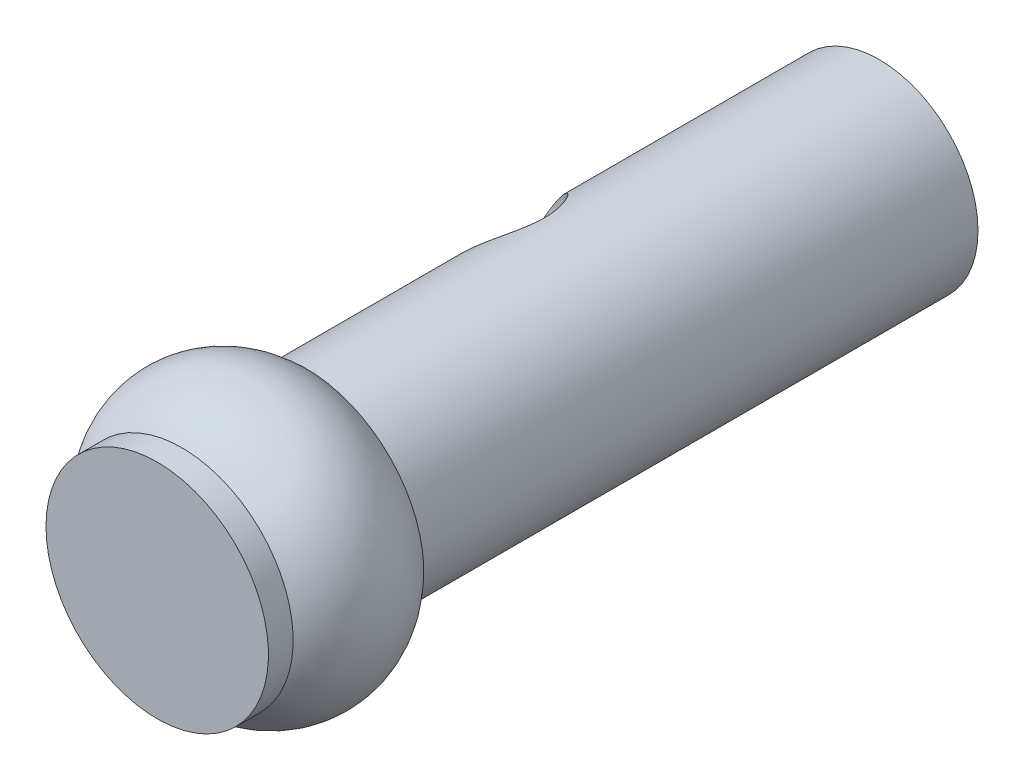
ISO-10303-21;
HEADER;
FILE_DESCRIPTION(('STEP AP214'),'2;1');
FILE_NAME('part.step','',(''),(''),'','','');
FILE_SCHEMA(('AUTOMOTIVE_DESIGN { 1 0 10303 214 1 1 1 1 }'));
ENDSEC;
DATA;
#1=APPLICATION_CONTEXT('core data for automotive mechanical design processes');
#2=APPLICATION_PROTOCOL_DEFINITION('international standard','automotive_design',2000,#1);
#3=PRODUCT_CONTEXT('',#1,'mechanical');
#4=PRODUCT('Part','Part','',(#3));
#5=PRODUCT_RELATED_PRODUCT_CATEGORY('part','',(#4));
#6=PRODUCT_DEFINITION_FORMATION('','',#4);
#7=PRODUCT_DEFINITION_CONTEXT('part definition',#1,'design');
#8=PRODUCT_DEFINITION('design','',#6,#7);
#9=PRODUCT_DEFINITION_SHAPE('','',#8);
#10=(LENGTH_UNIT() NAMED_UNIT(*) SI_UNIT(.MILLI.,.METRE.));
#11=(NAMED_UNIT(*) PLANE_ANGLE_UNIT() SI_UNIT($,.RADIAN.));
#12=(NAMED_UNIT(*) SI_UNIT($,.STERADIAN.) SOLID_ANGLE_UNIT());
#13=UNCERTAINTY_MEASURE_WITH_UNIT(LENGTH_MEASURE(1.E-05),#10,'distance_accuracy_value','');
#14=(GEOMETRIC_REPRESENTATION_CONTEXT(3) GLOBAL_UNCERTAINTY_ASSIGNED_CONTEXT((#13)) GLOBAL_UNIT_ASSIGNED_CONTEXT((#10,
#11,#12)) REPRESENTATION_CONTEXT('',''));
#15=CARTESIAN_POINT('',(0.,0.,0.));
#16=DIRECTION('',(0.,0.,1.));
#17=DIRECTION('',(1.,0.,0.));
#18=AXIS2_PLACEMENT_3D('',#15,#16,#17);
#19=CARTESIAN_POINT('',(8.,0.,-43.3427251355464));
#20=DIRECTION('',(0.,0.,1.));
#21=DIRECTION('',(1.,0.,0.));
#22=AXIS2_PLACEMENT_3D('',#19,#20,#21);
#23=PLANE('',#22);
#24=CARTESIAN_POINT('',(0.,0.,-43.3427251355464));
#25=DIRECTION('',(0.,0.,-1.));
#26=DIRECTION('',(-1.,0.,0.));
#27=AXIS2_PLACEMENT_3D('',#24,#25,#26);
#28=CIRCLE('',#27,7.);
#29=CARTESIAN_POINT('',(-7.,0.,-43.3427251355464));
#30=VERTEX_POINT('',#29);
#31=EDGE_CURVE('E56',#30,#30,#28,.T.);
#32=ORIENTED_EDGE('',*,*,#31,.F.);
#33=EDGE_LOOP('',(#32));
#34=FACE_BOUND('',#33,.T.);
#35=CARTESIAN_POINT('',(0.,0.,-43.3427251355464));
#36=DIRECTION('',(0.,0.,-1.));
#37=DIRECTION('',(-1.,0.,0.));
#38=AXIS2_PLACEMENT_3D('',#35,#36,#37);
#39=CIRCLE('',#38,8.);
#40=CARTESIAN_POINT('',(-8.,0.,-43.3427251355464));
#41=VERTEX_POINT('',#40);
#42=EDGE_CURVE('E10',#41,#41,#39,.T.);
#43=ORIENTED_EDGE('',*,*,#42,.T.);
#44=EDGE_LOOP('',(#43));
#45=FACE_BOUND('',#44,.T.);
#46=ADVANCED_FACE('F31',(#34,#45),#23,.F.);
#47=CARTESIAN_POINT('',(0.,0.,-12.7802251355462));
#48=DIRECTION('',(0.,0.,-1.));
#49=DIRECTION('',(-1.,0.,0.));
#50=AXIS2_PLACEMENT_3D('',#47,#48,#49);
#51=CYLINDRICAL_SURFACE('',#50,8.);
#52=CARTESIAN_POINT('',(-8.,0.,-18.3979131777564));
#53=CARTESIAN_POINT('',(-8.00000379197283,-0.0538071110118449,-18.6072115353037));
#54=CARTESIAN_POINT('',(-7.99950753431443,-0.0903312553594441,-18.8210144518937));
#55=CARTESIAN_POINT('',(-7.99903233148902,-0.125821796217382,-19.2517190856555));
#56=CARTESIAN_POINT('',(-7.99905323185375,-0.124799407335932,-19.468619858194));
#57=CARTESIAN_POINT('',(-7.99956684773895,-0.0853330152269476,-19.8986700638101));
#58=CARTESIAN_POINT('',(-8.00005902567663,-0.0469316490910135,-20.1118234893654));
#59=CARTESIAN_POINT('',(-7.99993171813882,0.0641395257388856,-20.5290010368897));
#60=CARTESIAN_POINT('',(-7.99931147665246,0.136832614669419,-20.7330188536219));
#61=CARTESIAN_POINT('',(-7.99432643087463,0.314332691594759,-21.1334744097809));
#62=CARTESIAN_POINT('',(-7.98985376226356,0.420008295089525,-21.3295218276569));
#63=CARTESIAN_POINT('',(-7.97382806730377,0.657424984493898,-21.7047854698601));
#64=CARTESIAN_POINT('',(-7.96227191116295,0.789177574914144,-21.8839942137409));
#65=CARTESIAN_POINT('',(-7.92606872681726,1.09793861649312,-22.2520235190141));
#66=CARTESIAN_POINT('',(-7.89955007526104,1.2788313048885,-22.4374090172871));
#67=CARTESIAN_POINT('',(-7.82763221286012,1.66323211588262,-22.779273410341));
#68=CARTESIAN_POINT('',(-7.78222060690003,1.86675502115549,-22.9357332303148));
#69=CARTESIAN_POINT('',(-7.69529435012389,2.18996617549552,-23.1496695319268));
#70=CARTESIAN_POINT('',(-7.66197740558374,2.30410445607535,-23.2191088716713));
#71=CARTESIAN_POINT('',(-7.58846793621744,2.53572166717991,-23.3480307412735));
#72=CARTESIAN_POINT('',(-7.5482784940826,2.65319908030714,-23.4075177117477));
#73=CARTESIAN_POINT('',(-7.46071241820469,2.89028284210116,-23.5158251831351));
#74=CARTESIAN_POINT('',(-7.41334013650209,3.00988786318972,-23.5646520994985));
#75=CARTESIAN_POINT('',(-7.3112435730698,3.2500350264143,-23.6510146054065));
#76=CARTESIAN_POINT('',(-7.25652043831672,3.37057701959266,-23.6885519535441));
#77=CARTESIAN_POINT('',(-7.14583575107216,3.59880786577426,-23.7484828627541));
#78=CARTESIAN_POINT('',(-7.09058663517385,3.70653761634433,-23.7720405518732));
#79=CARTESIAN_POINT('',(-6.97446955645627,3.92066333340195,-23.8092814377884));
#80=CARTESIAN_POINT('',(-6.91360223998162,4.02705945172129,-23.8229657688698));
#81=CARTESIAN_POINT('',(-6.78666910198313,4.2374771453676,-23.8402545740766));
#82=CARTESIAN_POINT('',(-6.72060575649686,4.34149982157525,-23.8438638196677));
#83=CARTESIAN_POINT('',(-6.58380893639153,4.54627547259711,-23.840961569166));
#84=CARTESIAN_POINT('',(-6.51307573225392,4.64702863628045,-23.8344506587481));
#85=CARTESIAN_POINT('',(-6.37464420957288,4.83489178714636,-23.8125196535284));
#86=CARTESIAN_POINT('',(-6.30731172822809,4.9223800921685,-23.7980199438428));
#87=CARTESIAN_POINT('',(-6.16996451203491,5.09348620289836,-23.7610222536169));
#88=CARTESIAN_POINT('',(-6.09994895241054,5.17710280071815,-23.7385217957683));
#89=CARTESIAN_POINT('',(-5.88683762990663,5.42140843313534,-23.6593763291729));
#90=CARTESIAN_POINT('',(-5.74055630336078,5.57571618096006,-23.5910676561981));
#91=CARTESIAN_POINT('',(-5.44045835219944,5.86914987080173,-23.4235701548818));
#92=CARTESIAN_POINT('',(-5.28654800882795,6.00766869896668,-23.3235024569189));
#93=CARTESIAN_POINT('',(-4.98092364033061,6.26339588211461,-23.096422248785));
#94=CARTESIAN_POINT('',(-4.82921049437364,6.38059591238782,-22.9693992546944));
#95=CARTESIAN_POINT('',(-4.51585600066594,6.60671318567899,-22.6749221102334));
#96=CARTESIAN_POINT('',(-4.35515675309513,6.71301953587711,-22.5044652776334));
#97=CARTESIAN_POINT('',(-4.05047915581013,6.90113798487598,-22.1366205813931));
#98=CARTESIAN_POINT('',(-3.90651949134214,6.98292286971633,-21.9392031477566));
#99=CARTESIAN_POINT('',(-3.70457453129652,7.09102162107309,-21.6175124562759));
#100=CARTESIAN_POINT('',(-3.63756224191589,7.12552118898537,-21.5015047355989));
#101=CARTESIAN_POINT('',(-3.51229029536752,7.18809501044659,-21.2632249275464));
#102=CARTESIAN_POINT('',(-3.45402625268954,7.2161724871197,-21.1409560204184));
#103=CARTESIAN_POINT('',(-3.34775881907738,7.26608285608204,-20.8909691958277));
#104=CARTESIAN_POINT('',(-3.29974382503592,7.28792281953068,-20.7632576387796));
#105=CARTESIAN_POINT('',(-3.21533704360038,7.32555456531639,-20.5031822065273));
#106=CARTESIAN_POINT('',(-3.17894276169418,7.34134764582772,-20.3708193365589));
#107=CARTESIAN_POINT('',(-3.12231800533015,7.36559376396495,-20.1173000435131));
#108=CARTESIAN_POINT('',(-3.1007559641428,7.37466022896961,-19.9964992643781));
#109=CARTESIAN_POINT('',(-3.06852935541023,7.38812808059409,-19.7532011012426));
#110=CARTESIAN_POINT('',(-3.05786301258706,7.39253022719357,-19.6307039969285));
#111=CARTESIAN_POINT('',(-3.04778440060533,7.39669117439936,-19.3852418384677));
#112=CARTESIAN_POINT('',(-3.04836537521865,7.39645276257402,-19.2622771096069));
#113=CARTESIAN_POINT('',(-3.06074500126026,7.39133849994213,-19.0170193331437));
#114=CARTESIAN_POINT('',(-3.07254283122624,7.38646298873186,-18.8947262370141));
#115=CARTESIAN_POINT('',(-3.10457704031209,7.37304915323547,-18.6687689547396));
#116=CARTESIAN_POINT('',(-3.1234201428225,7.36511089324098,-18.5648682167689));
#117=CARTESIAN_POINT('',(-3.16869634110085,7.34574462753782,-18.3590524731567));
#118=CARTESIAN_POINT('',(-3.1951318553091,7.33431550979895,-18.2571381113067));
#119=CARTESIAN_POINT('',(-3.28502045386628,7.29472200934024,-17.9552707363488));
#120=CARTESIAN_POINT('',(-3.35907354155438,7.26124454924504,-17.7590735750209));
#121=CARTESIAN_POINT('',(-3.53657594240227,7.17655511539993,-17.3662864942393));
#122=CARTESIAN_POINT('',(-3.64180898230458,7.1242044502762,-17.1707636934496));
#123=CARTESIAN_POINT('',(-3.87245389016822,7.00151158424241,-16.7980811855161));
#124=CARTESIAN_POINT('',(-3.99787794844169,6.93115849916124,-16.6209326787553));
#125=CARTESIAN_POINT('',(-4.28484535545407,6.75814888255125,-16.259810648122));
#126=CARTESIAN_POINT('',(-4.44893885505517,6.65208678895762,-16.0794824822805));
#127=CARTESIAN_POINT('',(-4.78838383861964,6.41205762819475,-15.7502356509382));
#128=CARTESIAN_POINT('',(-4.96374018869869,6.278078442574,-15.601330682531));
#129=CARTESIAN_POINT('',(-5.23128733017687,6.05374149648537,-15.4032594315316));
#130=CARTESIAN_POINT('',(-5.32254055589805,5.97376709183102,-15.3407587444703));
#131=CARTESIAN_POINT('',(-5.50463816680013,5.80639423729083,-15.2259768722189));
#132=CARTESIAN_POINT('',(-5.59548272710766,5.71899936722289,-15.1736907989801));
#133=CARTESIAN_POINT('',(-5.77553336841514,5.53710977468572,-15.0800254924121));
#134=CARTESIAN_POINT('',(-5.86474057402304,5.44262017107334,-15.0386384907449));
#135=CARTESIAN_POINT('',(-6.04039852189291,5.24698520570412,-14.9673330687028));
#136=CARTESIAN_POINT('',(-6.12684970473827,5.1458409157802,-14.9374128067172));
#137=CARTESIAN_POINT('',(-6.286057253359,4.94970164762314,-14.8923040989823));
#138=CARTESIAN_POINT('',(-6.35924020091749,4.85535088431945,-14.8758109303419));
#139=CARTESIAN_POINT('',(-6.50182170220991,4.66268918310291,-14.8523993992581));
#140=CARTESIAN_POINT('',(-6.5712206248221,4.5643786328325,-14.8454801019158));
#141=CARTESIAN_POINT('',(-6.70556860323235,4.36461166814436,-14.8413165470444));
#142=CARTESIAN_POINT('',(-6.77051910314775,4.26315629033578,-14.8440691343517));
#143=CARTESIAN_POINT('',(-6.89546950445539,4.05794672409862,-14.8592011496008));
#144=CARTESIAN_POINT('',(-6.9554695651635,3.9541926097848,-14.8715802676062));
#145=CARTESIAN_POINT('',(-7.06557350221683,3.75362429274648,-14.9044281849967));
#146=CARTESIAN_POINT('',(-7.11608493209942,3.6569147232328,-14.9241749800631));
#147=CARTESIAN_POINT('',(-7.21242099906376,3.46305141402775,-14.9714436282499));
#148=CARTESIAN_POINT('',(-7.25824416355781,3.36589754473094,-14.9989679141362));
#149=CARTESIAN_POINT('',(-7.38849703610198,3.07491774637975,-15.0927815122664));
#150=CARTESIAN_POINT('',(-7.46580387700481,2.88140108493642,-15.1703403058085));
#151=CARTESIAN_POINT('',(-7.60516076216173,2.49132075186231,-15.3572380181373));
#152=CARTESIAN_POINT('',(-7.66624378198602,2.29509629616426,-15.4679834204861));
#153=CARTESIAN_POINT('',(-7.76991906792228,1.91499592580466,-15.7162344925878));
#154=CARTESIAN_POINT('',(-7.81249787027167,1.73112908455929,-15.853759542346));
#155=CARTESIAN_POINT('',(-7.88624994099478,1.35914504031837,-16.1709882256674));
#156=CARTESIAN_POINT('',(-7.91538670591005,1.17326702488144,-16.35379514706));
#157=CARTESIAN_POINT('',(-7.9587040704766,0.830040759634544,-16.7460785715719));
#158=CARTESIAN_POINT('',(-7.97288654123033,0.672688942626882,-16.9555517344968));
#159=CARTESIAN_POINT('',(-7.99013953750528,0.414602748982877,-17.3653491108057));
#160=CARTESIAN_POINT('',(-7.99453360612728,0.308950994734855,-17.5625176482362));
#161=CARTESIAN_POINT('',(-7.99945991603774,0.12942226435128,-17.9708399152547));
#162=CARTESIAN_POINT('',(-7.99999608780582,0.0555130207305338,-18.1819791897964));
#163=CARTESIAN_POINT('',(-8.,0.,-18.3979131777564));
#164=B_SPLINE_CURVE_WITH_KNOTS('',3,(#52,#53,#54,#55,#56,#57,#58,#59,#60,#61,#62,#63,#64,#65,
#66,#67,#68,#69,#70,#71,#72,#73,#74,#75,#76,#77,#78,#79,#80,#81,#82,#83,#84,#85,#86,#87,#88,#89,
#90,#91,#92,#93,#94,#95,#96,#97,#98,#99,#100,#101,#102,#103,#104,#105,#106,#107,#108,#109,#110,
#111,#112,#113,#114,#115,#116,#117,#118,#119,#120,#121,#122,#123,#124,#125,#126,#127,#128,#129,
#130,#131,#132,#133,#134,#135,#136,#137,#138,#139,#140,#141,#142,#143,#144,#145,#146,#147,#148,
#149,#150,#151,#152,#153,#154,#155,#156,#157,#158,#159,#160,#161,#162,#163),.UNSPECIFIED.,.T.,
.F.,(4,2,2,2,2,2,2,2,2,2,2,2,2,2,2,2,2,2,2,2,2,2,2,2,2,2,2,2,2,2,2,2,2,2,2,2,2,2,2,2,2,2,2,2,2,
2,2,2,2,2,2,2,2,2,2,4),(0.,0.647569072093277,1.29494472621353,1.94158280242906,2.58866050659361,
3.25446745539479,3.9205687988601,4.69846796791319,5.47687830070617,5.88947889577805,
6.30189490004974,6.71406201508965,7.12616489294592,7.49567903538119,7.86515072000486,
8.23444739660493,8.6037227020203,8.93736230122465,9.27110529686991,9.9379873721824,
10.6252235569498,11.3127275249962,12.0813881489799,12.850898702755,13.2654554200628,
13.6798036205477,14.0936802134098,14.5074679033436,14.876046416214,15.2445648655893,
15.6128619539664,15.9811320723183,16.2984525124426,16.6158741421923,17.250357373612,
17.9322729058706,18.6146016989285,19.4088334066648,20.2034106011273,20.6123925442206,
21.0211782932048,21.4296718857647,21.8380998448641,22.1992319241449,22.5603287360002,
22.921307761743,23.2822751658634,23.6145228548239,23.9468745847011,24.6109896754841,
25.3086254282879,26.0067679380025,26.7904449700736,27.5740239357262,28.2428051071263,
28.9109048182528),.UNSPECIFIED.);
#165=CARTESIAN_POINT('',(-8.,0.,-18.3979131777564));
#166=VERTEX_POINT('',#165);
#167=EDGE_CURVE('E59',#166,#166,#164,.T.);
#168=ORIENTED_EDGE('',*,*,#167,.T.);
#169=EDGE_LOOP('',(#168));
#170=FACE_BOUND('',#169,.T.);
#171=ORIENTED_EDGE('',*,*,#42,.F.);
#172=EDGE_LOOP('',(#171));
#173=FACE_BOUND('',#172,.T.);
#174=CARTESIAN_POINT('',(0.,0.,3.00461290942641));
#175=DIRECTION('',(0.,0.,-1.));
#176=DIRECTION('',(-1.,0.,0.));
#177=AXIS2_PLACEMENT_3D('',#174,#175,#176);
#178=CIRCLE('',#177,8.);
#179=CARTESIAN_POINT('',(-8.,0.,3.00461290942641));
#180=VERTEX_POINT('',#179);
#181=EDGE_CURVE('E37',#180,#180,#178,.T.);
#182=ORIENTED_EDGE('',*,*,#181,.T.);
#183=EDGE_LOOP('',(#182));
#184=FACE_BOUND('',#183,.T.);
#185=ADVANCED_FACE('F69',(#170,#173,#184),#51,.T.);
#186=CARTESIAN_POINT('',(9.5,0.,3.00461290942641));
#187=DIRECTION('',(0.,0.,1.));
#188=DIRECTION('',(1.,0.,0.));
#189=AXIS2_PLACEMENT_3D('',#186,#187,#188);
#190=PLANE('',#189);
#191=ORIENTED_EDGE('',*,*,#181,.F.);
#192=EDGE_LOOP('',(#191));
#193=FACE_BOUND('',#192,.T.);
#194=CARTESIAN_POINT('',(0.,0.,3.0046129094264));
#195=DIRECTION('',(0.,0.,-1.));
#196=DIRECTION('',(-1.,0.,0.));
#197=AXIS2_PLACEMENT_3D('',#194,#195,#196);
#198=CIRCLE('',#197,9.5);
#199=CARTESIAN_POINT('',(-9.5,0.,3.0046129094264));
#200=VERTEX_POINT('',#199);
#201=EDGE_CURVE('E41',#200,#200,#198,.T.);
#202=ORIENTED_EDGE('',*,*,#201,.T.);
#203=EDGE_LOOP('',(#202));
#204=FACE_BOUND('',#203,.T.);
#205=ADVANCED_FACE('F97',(#193,#204),#190,.F.);
#206=CARTESIAN_POINT('',(0.,0.,7.80096361476951));
#207=DIRECTION('',(0.,0.,-1.));
#208=DIRECTION('',(-1.,0.,0.));
#209=AXIS2_PLACEMENT_3D('',#206,#207,#208);
#210=DEGENERATE_TOROIDAL_SURFACE('',#209,4.40146884766265,6.99999999999999,.T.);
#211=ORIENTED_EDGE('',*,*,#201,.F.);
#212=EDGE_LOOP('',(#211));
#213=FACE_BOUND('',#212,.T.);
#214=CARTESIAN_POINT('',(0.,0.,13.078606198441));
#215=DIRECTION('',(0.,0.,-1.));
#216=DIRECTION('',(-1.,0.,0.));
#217=AXIS2_PLACEMENT_3D('',#214,#215,#216);
#218=CIRCLE('',#217,9.);
#219=CARTESIAN_POINT('',(-9.,0.,13.078606198441));
#220=VERTEX_POINT('',#219);
#221=EDGE_CURVE('E45',#220,#220,#218,.T.);
#222=ORIENTED_EDGE('',*,*,#221,.T.);
#223=EDGE_LOOP('',(#222));
#224=FACE_BOUND('',#223,.T.);
#225=ADVANCED_FACE('F94',(#213,#224),#210,.T.);
#226=CARTESIAN_POINT('',(0.,0.,-12.7802251355462));
#227=DIRECTION('',(0.,0.,-1.));
#228=DIRECTION('',(-1.,0.,0.));
#229=AXIS2_PLACEMENT_3D('',#226,#227,#228);
#230=CYLINDRICAL_SURFACE('',#229,9.);
#231=ORIENTED_EDGE('',*,*,#221,.F.);
#232=EDGE_LOOP('',(#231));
#233=FACE_BOUND('',#232,.T.);
#234=CARTESIAN_POINT('',(0.,0.,15.078606198441));
#235=DIRECTION('',(0.,0.,-1.));
#236=DIRECTION('',(-1.,0.,0.));
#237=AXIS2_PLACEMENT_3D('',#234,#235,#236);
#238=CIRCLE('',#237,9.);
#239=CARTESIAN_POINT('',(-9.,0.,15.078606198441));
#240=VERTEX_POINT('',#239);
#241=EDGE_CURVE('E50',#240,#240,#238,.T.);
#242=ORIENTED_EDGE('',*,*,#241,.T.);
#243=EDGE_LOOP('',(#242));
#244=FACE_BOUND('',#243,.T.);
#245=ADVANCED_FACE('F90',(#233,#244),#230,.T.);
#246=CARTESIAN_POINT('',(9.,0.,15.078606198441));
#247=DIRECTION('',(0.,0.,-1.));
#248=DIRECTION('',(-1.,0.,0.));
#249=AXIS2_PLACEMENT_3D('',#246,#247,#248);
#250=PLANE('',#249);
#251=ORIENTED_EDGE('',*,*,#241,.F.);
#252=EDGE_LOOP('',(#251));
#253=FACE_BOUND('',#252,.T.);
#254=ADVANCED_FACE('F86',(#253),#250,.F.);
#255=CARTESIAN_POINT('',(7.,0.,3.00461290942641));
#256=DIRECTION('',(0.,0.,1.));
#257=DIRECTION('',(1.,0.,0.));
#258=AXIS2_PLACEMENT_3D('',#255,#256,#257);
#259=PLANE('',#258);
#260=CARTESIAN_POINT('',(0.,0.,3.00461290942641));
#261=DIRECTION('',(0.,0.,-1.));
#262=DIRECTION('',(-1.,0.,0.));
#263=AXIS2_PLACEMENT_3D('',#260,#261,#262);
#264=CIRCLE('',#263,7.);
#265=CARTESIAN_POINT('',(-7.,0.,3.00461290942641));
#266=VERTEX_POINT('',#265);
#267=EDGE_CURVE('E53',#266,#266,#264,.T.);
#268=ORIENTED_EDGE('',*,*,#267,.T.);
#269=EDGE_LOOP('',(#268));
#270=FACE_BOUND('',#269,.T.);
#271=ADVANCED_FACE('F82',(#270),#259,.F.);
#272=CARTESIAN_POINT('',(0.,0.,-12.7802251355462));
#273=DIRECTION('',(0.,0.,-1.));
#274=DIRECTION('',(-1.,0.,0.));
#275=AXIS2_PLACEMENT_3D('',#272,#273,#274);
#276=CYLINDRICAL_SURFACE('',#275,7.);
#277=CARTESIAN_POINT('',(-7.,0.,-17.0125869551495));
#278=CARTESIAN_POINT('',(-6.99998969239027,0.163939166663096,-16.7863705439136));
#279=CARTESIAN_POINT('',(-6.99417987923336,0.346939566076139,-16.5735661243944));
#280=CARTESIAN_POINT('',(-6.97112517190638,0.642908120423173,-16.2771448933804));
#281=CARTESIAN_POINT('',(-6.96102237710952,0.745324649368961,-16.1820006122651));
#282=CARTESIAN_POINT('',(-6.93516104535836,0.9564644944372,-15.9997240744739));
#283=CARTESIAN_POINT('',(-6.91940248057403,1.06518784159104,-15.9125918572251));
#284=CARTESIAN_POINT('',(-6.88135450532,1.28834287892545,-15.7466340636634));
#285=CARTESIAN_POINT('',(-6.85904132312948,1.4027940664094,-15.6678401682872));
#286=CARTESIAN_POINT('',(-6.80718813624187,1.63598403877499,-15.5196107739845));
#287=CARTESIAN_POINT('',(-6.77765151178421,1.75472079611704,-15.4501709212983));
#288=CARTESIAN_POINT('',(-6.71076942526775,1.99527929170501,-15.3214406781485));
#289=CARTESIAN_POINT('',(-6.6734333079383,2.11709718624143,-15.2621382949981));
#290=CARTESIAN_POINT('',(-6.59047884661211,2.36270575135859,-15.1543926138503));
#291=CARTESIAN_POINT('',(-6.54486181101501,2.48649610747229,-15.1059476030671));
#292=CARTESIAN_POINT('',(-6.44973731317135,2.723162834092,-15.0246541089129));
#293=CARTESIAN_POINT('',(-6.40098166860068,2.83598796877884,-14.9907765719174));
#294=CARTESIAN_POINT('',(-6.29648833605539,3.06098205691248,-14.9331397956153));
#295=CARTESIAN_POINT('',(-6.24075183505557,3.17315111852747,-14.9093788391722));
#296=CARTESIAN_POINT('',(-6.12257163370629,3.39558033128629,-14.8723954393083));
#297=CARTESIAN_POINT('',(-6.06013276348512,3.50584179149979,-14.8591654637315));
#298=CARTESIAN_POINT('',(-5.92897814426133,3.72335039321371,-14.8434636902323));
#299=CARTESIAN_POINT('',(-5.86026319242326,3.83059791527673,-14.8409905279543));
#300=CARTESIAN_POINT('',(-5.72734567544183,4.02609607310689,-14.846428397576));
#301=CARTESIAN_POINT('',(-5.66387743762559,4.11488970864576,-14.852921530235));
#302=CARTESIAN_POINT('',(-5.53331453841024,4.28885302017939,-14.873777905686));
#303=CARTESIAN_POINT('',(-5.46621880507696,4.37402161152904,-14.8881434863906));
#304=CARTESIAN_POINT('',(-5.32903517830085,4.54015201483817,-14.9245507204683));
#305=CARTESIAN_POINT('',(-5.25894838822489,4.62111535404585,-14.9465895643742));
#306=CARTESIAN_POINT('',(-5.11638846020954,4.77847960001639,-14.9980633523722));
#307=CARTESIAN_POINT('',(-5.04391440791724,4.85487872634817,-15.0275011596725));
#308=CARTESIAN_POINT('',(-4.82411120631765,5.076521516576,-15.1263356557988));
#309=CARTESIAN_POINT('',(-4.67410966191352,5.21455973720795,-15.2063318764639));
#310=CARTESIAN_POINT('',(-4.37239891231095,5.47004052101782,-15.3914799610618));
#311=CARTESIAN_POINT('',(-4.22068935879555,5.58747879918252,-15.496637048001));
#312=CARTESIAN_POINT('',(-3.90111353427367,5.81589174656337,-15.744051146635));
#313=CARTESIAN_POINT('',(-3.73364414585181,5.92414835594753,-15.8893246335899));
#314=CARTESIAN_POINT('',(-3.40868383996677,6.11691268673974,-16.2051654850545));
#315=CARTESIAN_POINT('',(-3.25120835617438,6.20138433646984,-16.3757706749372));
#316=CARTESIAN_POINT('',(-3.01733000083807,6.31702026022967,-16.6615945649118));
#317=CARTESIAN_POINT('',(-2.93511182663267,6.35551321343097,-16.7692045170032));
#318=CARTESIAN_POINT('',(-2.77770156111478,6.42587024845643,-16.9914934408686));
#319=CARTESIAN_POINT('',(-2.70251090400655,6.45773297877791,-17.1061738477183));
#320=CARTESIAN_POINT('',(-2.49011898818201,6.54389560314034,-17.4600075769393));
#321=CARTESIAN_POINT('',(-2.36560771664427,6.58899900026836,-17.7095342842311));
#322=CARTESIAN_POINT('',(-2.19314464457729,6.64801482609382,-18.1594493805097));
#323=CARTESIAN_POINT('',(-2.13358134640005,6.66707363810827,-18.3547506041809));
#324=CARTESIAN_POINT('',(-2.04622772195382,6.69440816522595,-18.7529936491609));
#325=CARTESIAN_POINT('',(-2.01838878064035,6.70270038200251,-18.9559232861844));
#326=CARTESIAN_POINT('',(-1.99762837978916,6.7089216812443,-19.3644013692206));
#327=CARTESIAN_POINT('',(-2.00481797465515,6.7068178036518,-19.5699560809105));
#328=CARTESIAN_POINT('',(-2.0534751623216,6.69207232668187,-19.9766410550529));
#329=CARTESIAN_POINT('',(-2.09497109197256,6.67942201593397,-20.1777675187541));
#330=CARTESIAN_POINT('',(-2.20591459355425,6.64358028970839,-20.5641312590363));
#331=CARTESIAN_POINT('',(-2.27445158899121,6.62072936295046,-20.7496682842556));
#332=CARTESIAN_POINT('',(-2.43398388707387,6.56375528219946,-21.1088725240308));
#333=CARTESIAN_POINT('',(-2.52498663625937,6.52962838938221,-21.2825357784633));
#334=CARTESIAN_POINT('',(-2.74370683973493,6.44115757802407,-21.6490234880727));
#335=CARTESIAN_POINT('',(-2.87512273285727,6.38417202380608,-21.8390019121959));
#336=CARTESIAN_POINT('',(-3.15524357978912,6.25048991642793,-22.1982934868499));
#337=CARTESIAN_POINT('',(-3.30396906588548,6.17376982135861,-22.3675815970234));
#338=CARTESIAN_POINT('',(-3.64123835647354,5.98209816417778,-22.7129163363965));
#339=CARTESIAN_POINT('',(-3.83204814504719,5.86269295310786,-22.8843818279409));
#340=CARTESIAN_POINT('',(-4.1222293186501,5.65873478039446,-23.1138059713833));
#341=CARTESIAN_POINT('',(-4.21962497627454,5.58660059968438,-23.1856560547499));
#342=CARTESIAN_POINT('',(-4.41456971540224,5.43386590721936,-23.3194323503706));
#343=CARTESIAN_POINT('',(-4.5121187466868,5.35326775630762,-23.3813613178001));
#344=CARTESIAN_POINT('',(-4.76457257022259,5.13238601460717,-23.5286069151399));
#345=CARTESIAN_POINT('',(-4.9186505078888,4.9853826613616,-23.6055571738266));
#346=CARTESIAN_POINT('',(-5.21804497721489,4.67108691665211,-23.7285333461121));
#347=CARTESIAN_POINT('',(-5.36336851004845,4.50381106908328,-23.7745842779368));
#348=CARTESIAN_POINT('',(-5.64029281411588,4.15179045051053,-23.8335090767797));
#349=CARTESIAN_POINT('',(-5.77184477453387,3.96698769357263,-23.846268531809));
#350=CARTESIAN_POINT('',(-6.01596064969863,3.58600133600046,-23.8374866426851));
#351=CARTESIAN_POINT('',(-6.12852366972534,3.38981719968384,-23.8159436827712));
#352=CARTESIAN_POINT('',(-6.32632389255247,3.00368831191675,-23.7419546425756));
#353=CARTESIAN_POINT('',(-6.41272149713414,2.81399178840745,-23.6912689198021));
#354=CARTESIAN_POINT('',(-6.56567992995673,2.43587453492444,-23.5627880113687));
#355=CARTESIAN_POINT('',(-6.63223742882856,2.24745402425723,-23.484988280452));
#356=CARTESIAN_POINT('',(-6.75070613036986,1.86314495332086,-23.2985509488774));
#357=CARTESIAN_POINT('',(-6.80119409627089,1.66771480202655,-23.1880772804891));
#358=CARTESIAN_POINT('',(-6.88309538107131,1.28867177671085,-22.9424933308003));
#359=CARTESIAN_POINT('',(-6.91449415621944,1.10506800799676,-22.8073643666681));
#360=CARTESIAN_POINT('',(-6.96513316305491,0.727054372375836,-22.492712703957));
#361=CARTESIAN_POINT('',(-6.98176809738121,0.535310079845708,-22.3095596252172));
#362=CARTESIAN_POINT('',(-6.99994724513691,0.179977331937023,-21.9169516820199));
#363=CARTESIAN_POINT('',(-7.00148763463153,0.0163960214602774,-21.707490166398));
#364=CARTESIAN_POINT('',(-6.99648786064371,-0.255219988654845,-21.2936984471261));
#365=CARTESIAN_POINT('',(-6.99098688054729,-0.367735616786178,-21.0923365822897));
#366=CARTESIAN_POINT('',(-6.98150398978567,-0.510772277799781,-20.7788008111776));
#367=CARTESIAN_POINT('',(-6.97813825614019,-0.554158123002737,-20.672386540131));
#368=CARTESIAN_POINT('',(-6.97156564538273,-0.631489828148019,-20.4561983847526));
#369=CARTESIAN_POINT('',(-6.96835868921942,-0.665440425308996,-20.346426217187));
#370=CARTESIAN_POINT('',(-6.96258607720752,-0.723364132008761,-20.1230612873241));
#371=CARTESIAN_POINT('',(-6.9600272408523,-0.747232775796372,-20.0094411003786));
#372=CARTESIAN_POINT('',(-6.95600555815165,-0.783790132206091,-19.7803860024426));
#373=CARTESIAN_POINT('',(-6.95454268560915,-0.796479112059612,-19.6649511348963));
#374=CARTESIAN_POINT('',(-6.95295183588293,-0.810255505242123,-19.4334181960835));
#375=CARTESIAN_POINT('',(-6.95282331024586,-0.811347685179747,-19.3173204169264));
#376=CARTESIAN_POINT('',(-6.95391450753231,-0.801923306756735,-19.0856424695294));
#377=CARTESIAN_POINT('',(-6.95513409285824,-0.791407933144132,-18.9700622496726));
#378=CARTESIAN_POINT('',(-6.96001251489008,-0.747712818111714,-18.6599370431876));
#379=CARTESIAN_POINT('',(-6.96478206746784,-0.703811467540539,-18.4668460813393));
#380=CARTESIAN_POINT('',(-6.97559477881568,-0.586883467098064,-18.0899819162006));
#381=CARTESIAN_POINT('',(-6.98163789482328,-0.513857795061806,-17.906208400315));
#382=CARTESIAN_POINT('',(-6.99055915155635,-0.368384627616395,-17.6028323130334));
#383=CARTESIAN_POINT('',(-6.99384554393795,-0.302069160652499,-17.4802377413207));
#384=CARTESIAN_POINT('',(-6.99856839418201,-0.15874770093711,-17.2415135939292));
#385=CARTESIAN_POINT('',(-7.00000513958191,-0.0817433718883786,-17.1253830160744));
#386=CARTESIAN_POINT('',(-7.,0.,-17.0125869551495));
#387=B_SPLINE_CURVE_WITH_KNOTS('',3,(#277,#278,#279,#280,#281,#282,#283,#284,#285,#286,#287,
#288,#289,#290,#291,#292,#293,#294,#295,#296,#297,#298,#299,#300,#301,#302,#303,#304,#305,#306,
#307,#308,#309,#310,#311,#312,#313,#314,#315,#316,#317,#318,#319,#320,#321,#322,#323,#324,#325,
#326,#327,#328,#329,#330,#331,#332,#333,#334,#335,#336,#337,#338,#339,#340,#341,#342,#343,#344,
#345,#346,#347,#348,#349,#350,#351,#352,#353,#354,#355,#356,#357,#358,#359,#360,#361,#362,#363,
#364,#365,#366,#367,#368,#369,#370,#371,#372,#373,#374,#375,#376,#377,#378,#379,#380,#381,#382,
#383,#384,#385,#386),.UNSPECIFIED.,.T.,.F.,(4,2,2,2,2,2,2,2,2,2,2,2,2,2,2,2,2,2,2,2,2,2,2,2,2,2,
2,2,2,2,2,2,2,2,2,2,2,2,2,2,2,2,2,2,2,2,2,2,2,2,2,2,2,2,4),(0.,0.837532090757401,
1.25765362252962,1.67777722159774,2.09944370689162,2.52091324792692,2.94188068465587,
3.36278166559128,3.74469326426015,4.12654001335031,4.50811340518233,4.88963839820319,
5.21725426444517,5.54496747685935,5.87256082722589,6.20028114348528,6.85435366000665,
7.50856206983589,8.24590936203787,8.98436894675594,9.40626321811865,9.82824340422331,
10.6698524971997,11.2826235865099,11.8944543849421,12.5082261904422,13.1225054753067,
13.7176576367953,14.3130073340001,15.0241914164098,15.7362278577059,16.5804689147037,
17.0026533237472,17.4247202847084,18.100891666868,18.7765149112731,19.4544570133813,
20.1324310498193,20.7732078394813,21.4140920974718,22.1017443918209,22.7899199431126,
23.5837031361102,24.3776874147817,25.066928867284,25.4114688220979,25.7558354776019,
26.1036876579483,26.451531523237,26.7992324094454,27.1468978101525,27.7383272432033,
28.3297368209677,28.747412135462,29.1650225122667),.UNSPECIFIED.);
#388=CARTESIAN_POINT('',(-7.,0.,-17.0125869551495));
#389=VERTEX_POINT('',#388);
#390=EDGE_CURVE('E65',#389,#389,#387,.T.);
#391=ORIENTED_EDGE('',*,*,#390,.T.);
#392=EDGE_LOOP('',(#391));
#393=FACE_BOUND('',#392,.T.);
#394=ORIENTED_EDGE('',*,*,#267,.F.);
#395=EDGE_LOOP('',(#394));
#396=FACE_BOUND('',#395,.T.);
#397=ORIENTED_EDGE('',*,*,#31,.T.);
#398=EDGE_LOOP('',(#397));
#399=FACE_BOUND('',#398,.T.);
#400=ADVANCED_FACE('F75',(#393,#396,#399),#276,.F.);
#401=CARTESIAN_POINT('',(-6.68151701603632,4.39969662186123,-19.3427251355464));
#402=DIRECTION('',(-0.83518962700454,0.549962077732653,0.));
#403=DIRECTION('',(-0.549962077732653,-0.83518962700454,0.));
#404=AXIS2_PLACEMENT_3D('',#401,#402,#403);
#405=CYLINDRICAL_SURFACE('',#404,4.5);
#406=ORIENTED_EDGE('',*,*,#390,.F.);
#407=EDGE_LOOP('',(#406));
#408=FACE_BOUND('',#407,.T.);
#409=ORIENTED_EDGE('',*,*,#167,.F.);
#410=EDGE_LOOP('',(#409));
#411=FACE_BOUND('',#410,.T.);
#412=ADVANCED_FACE('F72',(#408,#411),#405,.F.);
#413=CLOSED_SHELL('',(#46,#185,#205,#225,#245,#254,#271,#400,#412));
#414=MANIFOLD_SOLID_BREP('B2',#413);
#415=ADVANCED_BREP_SHAPE_REPRESENTATION('',(#18,#414),#14);
#416=SHAPE_DEFINITION_REPRESENTATION(#9,#415);
ENDSEC;
END-ISO-10303-21;
